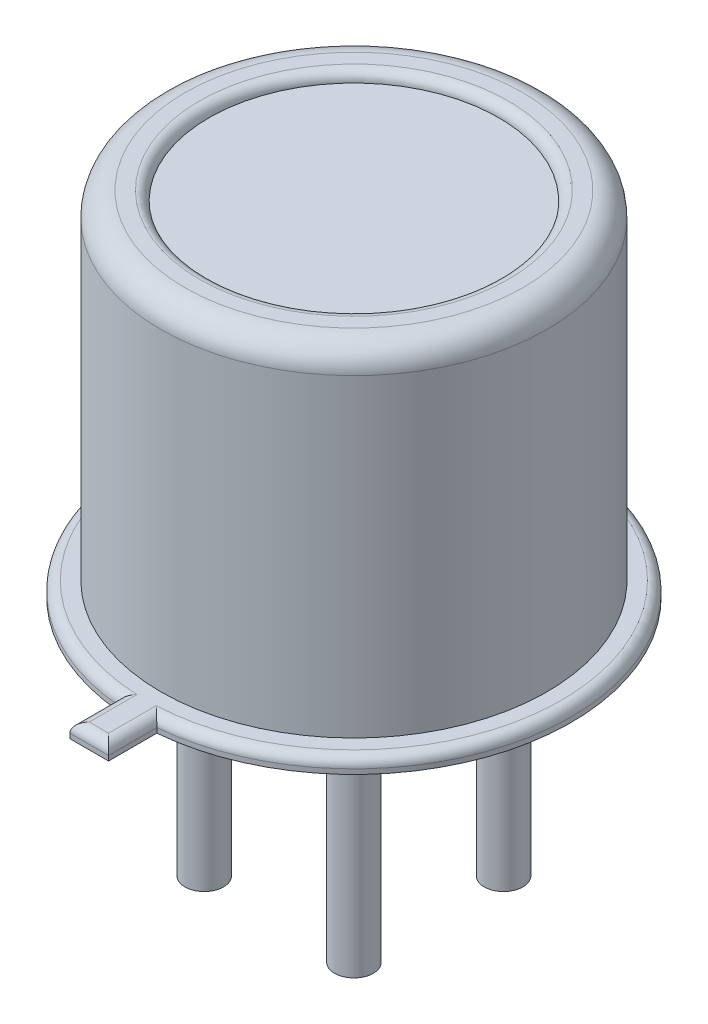
ISO-10303-21;
HEADER;
FILE_DESCRIPTION(('STEP AP214'),'2;1');
FILE_NAME('part.step','',(''),(''),'','','');
FILE_SCHEMA(('AUTOMOTIVE_DESIGN { 1 0 10303 214 1 1 1 1 }'));
ENDSEC;
DATA;
#1=APPLICATION_CONTEXT('core data for automotive mechanical design processes');
#2=APPLICATION_PROTOCOL_DEFINITION('international standard','automotive_design',2000,#1);
#3=PRODUCT_CONTEXT('',#1,'mechanical');
#4=PRODUCT('Part','Part','',(#3));
#5=PRODUCT_RELATED_PRODUCT_CATEGORY('part','',(#4));
#6=PRODUCT_DEFINITION_FORMATION('','',#4);
#7=PRODUCT_DEFINITION_CONTEXT('part definition',#1,'design');
#8=PRODUCT_DEFINITION('design','',#6,#7);
#9=PRODUCT_DEFINITION_SHAPE('','',#8);
#10=(LENGTH_UNIT() NAMED_UNIT(*) SI_UNIT(.MILLI.,.METRE.));
#11=(NAMED_UNIT(*) PLANE_ANGLE_UNIT() SI_UNIT($,.RADIAN.));
#12=(NAMED_UNIT(*) SI_UNIT($,.STERADIAN.) SOLID_ANGLE_UNIT());
#13=UNCERTAINTY_MEASURE_WITH_UNIT(LENGTH_MEASURE(1.E-05),#10,'distance_accuracy_value','');
#14=(GEOMETRIC_REPRESENTATION_CONTEXT(3) GLOBAL_UNCERTAINTY_ASSIGNED_CONTEXT((#13)) GLOBAL_UNIT_ASSIGNED_CONTEXT((#10,
#11,#12)) REPRESENTATION_CONTEXT('',''));
#15=CARTESIAN_POINT('',(0.,0.,0.));
#16=DIRECTION('',(0.,0.,1.));
#17=DIRECTION('',(1.,0.,0.));
#18=AXIS2_PLACEMENT_3D('',#15,#16,#17);
#19=CARTESIAN_POINT('',(0.,7.,0.));
#20=DIRECTION('',(0.,-1.,0.));
#21=DIRECTION('',(0.,0.,-1.));
#22=AXIS2_PLACEMENT_3D('',#19,#20,#21);
#23=CYLINDRICAL_SURFACE('',#22,4.);
#24=CARTESIAN_POINT('',(0.,6.5,0.));
#25=DIRECTION('',(0.,1.,0.));
#26=DIRECTION('',(0.,0.,1.));
#27=AXIS2_PLACEMENT_3D('',#24,#25,#26);
#28=CIRCLE('',#27,4.);
#29=CARTESIAN_POINT('',(0.,6.5,4.));
#30=VERTEX_POINT('',#29);
#31=EDGE_CURVE('E127',#30,#30,#28,.F.);
#32=ORIENTED_EDGE('',*,*,#31,.T.);
#33=EDGE_LOOP('',(#32));
#34=FACE_BOUND('',#33,.T.);
#35=CARTESIAN_POINT('',(0.,0.,0.));
#36=DIRECTION('',(0.,1.,0.));
#37=DIRECTION('',(0.,0.,1.));
#38=AXIS2_PLACEMENT_3D('',#35,#36,#37);
#39=CIRCLE('',#38,4.);
#40=CARTESIAN_POINT('',(0.,0.,4.));
#41=VERTEX_POINT('',#40);
#42=EDGE_CURVE('E104',#41,#41,#39,.T.);
#43=ORIENTED_EDGE('',*,*,#42,.T.);
#44=EDGE_LOOP('',(#43));
#45=FACE_BOUND('',#44,.T.);
#46=ADVANCED_FACE('F34',(#34,#45),#23,.T.);
#47=CARTESIAN_POINT('',(0.,7.,0.));
#48=DIRECTION('',(0.,1.,0.));
#49=DIRECTION('',(0.,0.,1.));
#50=AXIS2_PLACEMENT_3D('',#47,#48,#49);
#51=PLANE('',#50);
#52=CARTESIAN_POINT('',(0.,7.,0.));
#53=DIRECTION('',(0.,1.,0.));
#54=DIRECTION('',(0.,0.,1.));
#55=AXIS2_PLACEMENT_3D('',#52,#53,#54);
#56=CIRCLE('',#55,3.2);
#57=CARTESIAN_POINT('',(0.,7.,3.2));
#58=VERTEX_POINT('',#57);
#59=EDGE_CURVE('E130',#58,#58,#56,.F.);
#60=ORIENTED_EDGE('',*,*,#59,.T.);
#61=EDGE_LOOP('',(#60));
#62=FACE_BOUND('',#61,.T.);
#63=CARTESIAN_POINT('',(0.,7.,0.));
#64=DIRECTION('',(0.,1.,0.));
#65=DIRECTION('',(0.,0.,1.));
#66=AXIS2_PLACEMENT_3D('',#63,#64,#65);
#67=CIRCLE('',#66,3.5);
#68=CARTESIAN_POINT('',(0.,7.,3.5));
#69=VERTEX_POINT('',#68);
#70=EDGE_CURVE('E124',#69,#69,#67,.T.);
#71=ORIENTED_EDGE('',*,*,#70,.T.);
#72=EDGE_LOOP('',(#71));
#73=FACE_BOUND('',#72,.T.);
#74=ADVANCED_FACE('F175',(#62,#73),#51,.T.);
#75=CARTESIAN_POINT('',(0.,-0.3,5.48236258668128));
#76=DIRECTION('',(0.,0.,-1.));
#77=DIRECTION('',(-1.,0.,0.));
#78=AXIS2_PLACEMENT_3D('',#75,#76,#77);
#79=PLANE('',#78);
#80=DIRECTION('',(0.,1.,0.));
#81=VECTOR('',#80,1.);
#82=CARTESIAN_POINT('',(0.4,-0.3,5.48236258668128));
#83=LINE('',#82,#81);
#84=CARTESIAN_POINT('',(0.4,-0.3,5.48236258668128));
#85=VERTEX_POINT('',#84);
#86=CARTESIAN_POINT('',(0.4,-0.2,5.48236258668128));
#87=VERTEX_POINT('',#86);
#88=EDGE_CURVE('E116',#85,#87,#83,.T.);
#89=ORIENTED_EDGE('',*,*,#88,.T.);
#90=DIRECTION('',(-1.,0.,0.));
#91=VECTOR('',#90,1.);
#92=CARTESIAN_POINT('',(0.,-0.2,5.48236258668128));
#93=LINE('',#92,#91);
#94=CARTESIAN_POINT('',(-0.4,-0.2,5.48236258668128));
#95=VERTEX_POINT('',#94);
#96=EDGE_CURVE('E52',#87,#95,#93,.T.);
#97=ORIENTED_EDGE('',*,*,#96,.T.);
#98=DIRECTION('',(0.,1.,0.));
#99=VECTOR('',#98,1.);
#100=CARTESIAN_POINT('',(-0.4,-0.3,5.48236258668128));
#101=LINE('',#100,#99);
#102=CARTESIAN_POINT('',(-0.4,-0.3,5.48236258668128));
#103=VERTEX_POINT('',#102);
#104=EDGE_CURVE('E100',#103,#95,#101,.T.);
#105=ORIENTED_EDGE('',*,*,#104,.F.);
#106=DIRECTION('',(-1.,0.,0.));
#107=VECTOR('',#106,1.);
#108=CARTESIAN_POINT('',(0.,-0.3,5.48236258668128));
#109=LINE('',#108,#107);
#110=EDGE_CURVE('E90',#85,#103,#109,.T.);
#111=ORIENTED_EDGE('',*,*,#110,.F.);
#112=EDGE_LOOP('',(#89,#97,#105,#111));
#113=FACE_BOUND('',#112,.T.);
#114=ADVANCED_FACE('F101',(#113),#79,.F.);
#115=CARTESIAN_POINT('',(-0.4,-0.3,5.48236258668128));
#116=DIRECTION('',(1.,0.,0.));
#117=DIRECTION('',(0.,0.,-1.));
#118=AXIS2_PLACEMENT_3D('',#115,#116,#117);
#119=PLANE('',#118);
#120=ORIENTED_EDGE('',*,*,#104,.T.);
#121=DIRECTION('',(0.,0.,-1.));
#122=VECTOR('',#121,1.);
#123=CARTESIAN_POINT('',(-0.4,-0.2,5.48236258668128));
#124=LINE('',#123,#122);
#125=CARTESIAN_POINT('',(-0.4,-0.2,4.48236258668128));
#126=VERTEX_POINT('',#125);
#127=EDGE_CURVE('E147',#95,#126,#124,.T.);
#128=ORIENTED_EDGE('',*,*,#127,.T.);
#129=DIRECTION('',(0.,1.,0.));
#130=VECTOR('',#129,1.);
#131=CARTESIAN_POINT('',(-0.4,-0.3,4.48236258668128));
#132=LINE('',#131,#130);
#133=CARTESIAN_POINT('',(-0.4,-0.3,4.48236258668128));
#134=VERTEX_POINT('',#133);
#135=EDGE_CURVE('E105',#134,#126,#132,.T.);
#136=ORIENTED_EDGE('',*,*,#135,.F.);
#137=DIRECTION('',(0.,0.,-1.));
#138=VECTOR('',#137,1.);
#139=CARTESIAN_POINT('',(-0.4,-0.3,5.48236258668128));
#140=LINE('',#139,#138);
#141=EDGE_CURVE('E93',#103,#134,#140,.T.);
#142=ORIENTED_EDGE('',*,*,#141,.F.);
#143=EDGE_LOOP('',(#120,#128,#136,#142));
#144=FACE_BOUND('',#143,.T.);
#145=ADVANCED_FACE('F107',(#144),#119,.F.);
#146=CARTESIAN_POINT('',(0.,-0.3,0.));
#147=DIRECTION('',(0.,1.,0.));
#148=DIRECTION('',(0.,0.,1.));
#149=AXIS2_PLACEMENT_3D('',#146,#147,#148);
#150=CYLINDRICAL_SURFACE('',#149,4.50017492532014);
#151=ORIENTED_EDGE('',*,*,#135,.T.);
#152=CARTESIAN_POINT('',(0.,-0.2,0.));
#153=DIRECTION('',(0.,-1.,0.));
#154=DIRECTION('',(0.,0.,-1.));
#155=AXIS2_PLACEMENT_3D('',#152,#153,#154);
#156=CIRCLE('',#155,4.50017492532014);
#157=CARTESIAN_POINT('',(0.399999999999999,-0.2,4.48236258668128));
#158=VERTEX_POINT('',#157);
#159=EDGE_CURVE('E133',#126,#158,#156,.T.);
#160=ORIENTED_EDGE('',*,*,#159,.T.);
#161=DIRECTION('',(0.,1.,0.));
#162=VECTOR('',#161,1.);
#163=CARTESIAN_POINT('',(0.399999999999999,-0.3,4.48236258668128));
#164=LINE('',#163,#162);
#165=CARTESIAN_POINT('',(0.399999999999999,-0.3,4.48236258668128));
#166=VERTEX_POINT('',#165);
#167=EDGE_CURVE('E118',#166,#158,#164,.T.);
#168=ORIENTED_EDGE('',*,*,#167,.F.);
#169=CARTESIAN_POINT('',(0.,-0.3,0.));
#170=DIRECTION('',(0.,-1.,0.));
#171=DIRECTION('',(0.,0.,-1.));
#172=AXIS2_PLACEMENT_3D('',#169,#170,#171);
#173=CIRCLE('',#172,4.50017492532014);
#174=EDGE_CURVE('E110',#134,#166,#173,.T.);
#175=ORIENTED_EDGE('',*,*,#174,.F.);
#176=EDGE_LOOP('',(#151,#160,#168,#175));
#177=FACE_BOUND('',#176,.T.);
#178=ADVANCED_FACE('F241',(#177),#150,.T.);
#179=CARTESIAN_POINT('',(0.4,-0.3,5.48236258668128));
#180=DIRECTION('',(-1.,0.,0.));
#181=DIRECTION('',(0.,0.,1.));
#182=AXIS2_PLACEMENT_3D('',#179,#180,#181);
#183=PLANE('',#182);
#184=ORIENTED_EDGE('',*,*,#167,.T.);
#185=DIRECTION('',(0.,0.,1.));
#186=VECTOR('',#185,1.);
#187=CARTESIAN_POINT('',(0.4,-0.2,5.48236258668128));
#188=LINE('',#187,#186);
#189=EDGE_CURVE('E137',#158,#87,#188,.T.);
#190=ORIENTED_EDGE('',*,*,#189,.T.);
#191=ORIENTED_EDGE('',*,*,#88,.F.);
#192=DIRECTION('',(0.,0.,1.));
#193=VECTOR('',#192,1.);
#194=CARTESIAN_POINT('',(0.4,-0.3,5.48236258668128));
#195=LINE('',#194,#193);
#196=EDGE_CURVE('E96',#166,#85,#195,.T.);
#197=ORIENTED_EDGE('',*,*,#196,.F.);
#198=EDGE_LOOP('',(#184,#190,#191,#197));
#199=FACE_BOUND('',#198,.T.);
#200=ADVANCED_FACE('F232',(#199),#183,.F.);
#201=CARTESIAN_POINT('',(0.,-0.3,0.));
#202=DIRECTION('',(0.,-1.,0.));
#203=DIRECTION('',(0.,0.,-1.));
#204=AXIS2_PLACEMENT_3D('',#201,#202,#203);
#205=PLANE('',#204);
#206=CARTESIAN_POINT('',(-1.54999999999997,-0.3,-1.55));
#207=DIRECTION('',(0.,-1.,0.));
#208=DIRECTION('',(0.,0.,-1.));
#209=AXIS2_PLACEMENT_3D('',#206,#207,#208);
#210=CIRCLE('',#209,0.4);
#211=CARTESIAN_POINT('',(-1.54999999999997,-0.3,-1.95));
#212=VERTEX_POINT('',#211);
#213=EDGE_CURVE('E202',#212,#212,#210,.T.);
#214=ORIENTED_EDGE('',*,*,#213,.F.);
#215=EDGE_LOOP('',(#214));
#216=FACE_BOUND('',#215,.T.);
#217=CARTESIAN_POINT('',(1.55000000000003,-0.3,-1.54999999999996));
#218=DIRECTION('',(0.,-1.,0.));
#219=DIRECTION('',(0.,0.,-1.));
#220=AXIS2_PLACEMENT_3D('',#217,#218,#219);
#221=CIRCLE('',#220,0.4);
#222=CARTESIAN_POINT('',(1.55000000000003,-0.3,-1.94999999999996));
#223=VERTEX_POINT('',#222);
#224=EDGE_CURVE('E210',#223,#223,#221,.T.);
#225=ORIENTED_EDGE('',*,*,#224,.F.);
#226=EDGE_LOOP('',(#225));
#227=FACE_BOUND('',#226,.T.);
#228=CARTESIAN_POINT('',(1.55,-0.3,1.55000000000004));
#229=DIRECTION('',(0.,-1.,0.));
#230=DIRECTION('',(0.,0.,-1.));
#231=AXIS2_PLACEMENT_3D('',#228,#229,#230);
#232=CIRCLE('',#231,0.4);
#233=CARTESIAN_POINT('',(1.55,-0.3,1.15000000000004));
#234=VERTEX_POINT('',#233);
#235=EDGE_CURVE('E215',#234,#234,#232,.T.);
#236=ORIENTED_EDGE('',*,*,#235,.F.);
#237=EDGE_LOOP('',(#236));
#238=FACE_BOUND('',#237,.T.);
#239=CARTESIAN_POINT('',(-1.55,-0.3,1.55));
#240=DIRECTION('',(0.,-1.,0.));
#241=DIRECTION('',(0.,0.,-1.));
#242=AXIS2_PLACEMENT_3D('',#239,#240,#241);
#243=CIRCLE('',#242,0.4);
#244=CARTESIAN_POINT('',(-1.55,-0.3,1.15));
#245=VERTEX_POINT('',#244);
#246=EDGE_CURVE('E221',#245,#245,#243,.T.);
#247=ORIENTED_EDGE('',*,*,#246,.F.);
#248=EDGE_LOOP('',(#247));
#249=FACE_BOUND('',#248,.T.);
#250=ORIENTED_EDGE('',*,*,#110,.T.);
#251=ORIENTED_EDGE('',*,*,#141,.T.);
#252=ORIENTED_EDGE('',*,*,#174,.T.);
#253=ORIENTED_EDGE('',*,*,#196,.T.);
#254=EDGE_LOOP('',(#250,#251,#252,#253));
#255=FACE_BOUND('',#254,.T.);
#256=ADVANCED_FACE('F91',(#216,#227,#238,#249,#255),#205,.T.);
#257=CARTESIAN_POINT('',(0.,0.,0.));
#258=DIRECTION('',(0.,-1.,0.));
#259=DIRECTION('',(0.,0.,-1.));
#260=AXIS2_PLACEMENT_3D('',#257,#258,#259);
#261=PLANE('',#260);
#262=ORIENTED_EDGE('',*,*,#42,.F.);
#263=EDGE_LOOP('',(#262));
#264=FACE_BOUND('',#263,.T.);
#265=DIRECTION('',(0.,0.,1.));
#266=VECTOR('',#265,1.);
#267=CARTESIAN_POINT('',(0.2,0.,0.));
#268=LINE('',#267,#266);
#269=CARTESIAN_POINT('',(0.2,0.,5.28236258668128));
#270=VERTEX_POINT('',#269);
#271=CARTESIAN_POINT('',(0.2,0.,4.2955214338136));
#272=VERTEX_POINT('',#271);
#273=EDGE_CURVE('E144',#270,#272,#268,.F.);
#274=ORIENTED_EDGE('',*,*,#273,.T.);
#275=CARTESIAN_POINT('',(0.,0.,0.));
#276=DIRECTION('',(0.,-1.,0.));
#277=DIRECTION('',(0.,0.,-1.));
#278=AXIS2_PLACEMENT_3D('',#275,#276,#277);
#279=CIRCLE('',#278,4.30017492532014);
#280=CARTESIAN_POINT('',(-0.2,0.,4.2955214338136));
#281=VERTEX_POINT('',#280);
#282=EDGE_CURVE('E59',#272,#281,#279,.F.);
#283=ORIENTED_EDGE('',*,*,#282,.T.);
#284=DIRECTION('',(0.,0.,-1.));
#285=VECTOR('',#284,1.);
#286=CARTESIAN_POINT('',(-0.2,0.,0.));
#287=LINE('',#286,#285);
#288=CARTESIAN_POINT('',(-0.2,0.,5.28236258668128));
#289=VERTEX_POINT('',#288);
#290=EDGE_CURVE('E140',#281,#289,#287,.F.);
#291=ORIENTED_EDGE('',*,*,#290,.T.);
#292=DIRECTION('',(-1.,0.,0.));
#293=VECTOR('',#292,1.);
#294=CARTESIAN_POINT('',(0.,0.,5.28236258668128));
#295=LINE('',#294,#293);
#296=EDGE_CURVE('E142',#289,#270,#295,.F.);
#297=ORIENTED_EDGE('',*,*,#296,.T.);
#298=EDGE_LOOP('',(#274,#283,#291,#297));
#299=FACE_BOUND('',#298,.T.);
#300=ADVANCED_FACE('F231',(#264,#299),#261,.F.);
#301=CARTESIAN_POINT('',(-1.55,-5.3,1.55));
#302=DIRECTION('',(0.,1.,0.));
#303=DIRECTION('',(0.,0.,1.));
#304=AXIS2_PLACEMENT_3D('',#301,#302,#303);
#305=CYLINDRICAL_SURFACE('',#304,0.4);
#306=CARTESIAN_POINT('',(-1.55,-5.3,1.55));
#307=DIRECTION('',(0.,-1.,0.));
#308=DIRECTION('',(0.,0.,-1.));
#309=AXIS2_PLACEMENT_3D('',#306,#307,#308);
#310=CIRCLE('',#309,0.4);
#311=CARTESIAN_POINT('',(-1.55,-5.3,1.15));
#312=VERTEX_POINT('',#311);
#313=EDGE_CURVE('E98',#312,#312,#310,.T.);
#314=ORIENTED_EDGE('',*,*,#313,.F.);
#315=EDGE_LOOP('',(#314));
#316=FACE_BOUND('',#315,.T.);
#317=ORIENTED_EDGE('',*,*,#246,.T.);
#318=EDGE_LOOP('',(#317));
#319=FACE_BOUND('',#318,.T.);
#320=ADVANCED_FACE('F228',(#316,#319),#305,.T.);
#321=CARTESIAN_POINT('',(-1.55,-5.3,1.55));
#322=DIRECTION('',(0.,-1.,0.));
#323=DIRECTION('',(0.,0.,-1.));
#324=AXIS2_PLACEMENT_3D('',#321,#322,#323);
#325=PLANE('',#324);
#326=ORIENTED_EDGE('',*,*,#313,.T.);
#327=EDGE_LOOP('',(#326));
#328=FACE_BOUND('',#327,.T.);
#329=ADVANCED_FACE('F373',(#328),#325,.T.);
#330=CARTESIAN_POINT('',(1.55,-5.3,1.55000000000004));
#331=DIRECTION('',(0.,1.,0.));
#332=DIRECTION('',(0.,0.,1.));
#333=AXIS2_PLACEMENT_3D('',#330,#331,#332);
#334=CYLINDRICAL_SURFACE('',#333,0.4);
#335=CARTESIAN_POINT('',(1.55,-5.3,1.55000000000004));
#336=DIRECTION('',(0.,-1.,0.));
#337=DIRECTION('',(0.,0.,-1.));
#338=AXIS2_PLACEMENT_3D('',#335,#336,#337);
#339=CIRCLE('',#338,0.4);
#340=CARTESIAN_POINT('',(1.55,-5.3,1.15000000000004));
#341=VERTEX_POINT('',#340);
#342=EDGE_CURVE('E218',#341,#341,#339,.T.);
#343=ORIENTED_EDGE('',*,*,#342,.F.);
#344=EDGE_LOOP('',(#343));
#345=FACE_BOUND('',#344,.T.);
#346=ORIENTED_EDGE('',*,*,#235,.T.);
#347=EDGE_LOOP('',(#346));
#348=FACE_BOUND('',#347,.T.);
#349=ADVANCED_FACE('F364',(#345,#348),#334,.T.);
#350=CARTESIAN_POINT('',(1.55,-5.3,1.55000000000004));
#351=DIRECTION('',(0.,-1.,0.));
#352=DIRECTION('',(0.,0.,-1.));
#353=AXIS2_PLACEMENT_3D('',#350,#351,#352);
#354=PLANE('',#353);
#355=ORIENTED_EDGE('',*,*,#342,.T.);
#356=EDGE_LOOP('',(#355));
#357=FACE_BOUND('',#356,.T.);
#358=ADVANCED_FACE('F355',(#357),#354,.T.);
#359=CARTESIAN_POINT('',(1.55000000000003,-5.3,-1.54999999999996));
#360=DIRECTION('',(0.,1.,0.));
#361=DIRECTION('',(0.,0.,1.));
#362=AXIS2_PLACEMENT_3D('',#359,#360,#361);
#363=CYLINDRICAL_SURFACE('',#362,0.4);
#364=CARTESIAN_POINT('',(1.55000000000003,-5.3,-1.54999999999996));
#365=DIRECTION('',(0.,-1.,0.));
#366=DIRECTION('',(0.,0.,-1.));
#367=AXIS2_PLACEMENT_3D('',#364,#365,#366);
#368=CIRCLE('',#367,0.4);
#369=CARTESIAN_POINT('',(1.55000000000003,-5.3,-1.94999999999996));
#370=VERTEX_POINT('',#369);
#371=EDGE_CURVE('E212',#370,#370,#368,.T.);
#372=ORIENTED_EDGE('',*,*,#371,.F.);
#373=EDGE_LOOP('',(#372));
#374=FACE_BOUND('',#373,.T.);
#375=ORIENTED_EDGE('',*,*,#224,.T.);
#376=EDGE_LOOP('',(#375));
#377=FACE_BOUND('',#376,.T.);
#378=ADVANCED_FACE('F346',(#374,#377),#363,.T.);
#379=CARTESIAN_POINT('',(1.55000000000003,-5.3,-1.54999999999996));
#380=DIRECTION('',(0.,-1.,0.));
#381=DIRECTION('',(0.,0.,-1.));
#382=AXIS2_PLACEMENT_3D('',#379,#380,#381);
#383=PLANE('',#382);
#384=ORIENTED_EDGE('',*,*,#371,.T.);
#385=EDGE_LOOP('',(#384));
#386=FACE_BOUND('',#385,.T.);
#387=ADVANCED_FACE('F337',(#386),#383,.T.);
#388=CARTESIAN_POINT('',(-1.54999999999997,-5.3,-1.55));
#389=DIRECTION('',(0.,1.,0.));
#390=DIRECTION('',(0.,0.,1.));
#391=AXIS2_PLACEMENT_3D('',#388,#389,#390);
#392=CYLINDRICAL_SURFACE('',#391,0.4);
#393=CARTESIAN_POINT('',(-1.54999999999997,-5.3,-1.55));
#394=DIRECTION('',(0.,-1.,0.));
#395=DIRECTION('',(0.,0.,-1.));
#396=AXIS2_PLACEMENT_3D('',#393,#394,#395);
#397=CIRCLE('',#396,0.4);
#398=CARTESIAN_POINT('',(-1.54999999999997,-5.3,-1.95));
#399=VERTEX_POINT('',#398);
#400=EDGE_CURVE('E205',#399,#399,#397,.T.);
#401=ORIENTED_EDGE('',*,*,#400,.F.);
#402=EDGE_LOOP('',(#401));
#403=FACE_BOUND('',#402,.T.);
#404=ORIENTED_EDGE('',*,*,#213,.T.);
#405=EDGE_LOOP('',(#404));
#406=FACE_BOUND('',#405,.T.);
#407=ADVANCED_FACE('F328',(#403,#406),#392,.T.);
#408=CARTESIAN_POINT('',(-1.54999999999997,-5.3,-1.55));
#409=DIRECTION('',(0.,-1.,0.));
#410=DIRECTION('',(0.,0.,-1.));
#411=AXIS2_PLACEMENT_3D('',#408,#409,#410);
#412=PLANE('',#411);
#413=ORIENTED_EDGE('',*,*,#400,.T.);
#414=EDGE_LOOP('',(#413));
#415=FACE_BOUND('',#414,.T.);
#416=ADVANCED_FACE('F320',(#415),#412,.T.);
#417=CARTESIAN_POINT('',(0.,6.8,0.));
#418=DIRECTION('',(0.,1.,0.));
#419=DIRECTION('',(0.,0.,1.));
#420=AXIS2_PLACEMENT_3D('',#417,#418,#419);
#421=PLANE('',#420);
#422=CARTESIAN_POINT('',(0.,6.8,0.));
#423=DIRECTION('',(0.,1.,0.));
#424=DIRECTION('',(0.,0.,1.));
#425=AXIS2_PLACEMENT_3D('',#422,#423,#424);
#426=CIRCLE('',#425,3.);
#427=CARTESIAN_POINT('',(0.,6.8,3.));
#428=VERTEX_POINT('',#427);
#429=EDGE_CURVE('E200',#428,#428,#426,.T.);
#430=ORIENTED_EDGE('',*,*,#429,.T.);
#431=EDGE_LOOP('',(#430));
#432=FACE_BOUND('',#431,.T.);
#433=ADVANCED_FACE('F189',(#432),#421,.T.);
#434=CARTESIAN_POINT('',(0.,6.5,0.));
#435=DIRECTION('',(0.,1.,0.));
#436=DIRECTION('',(0.,0.,1.));
#437=AXIS2_PLACEMENT_3D('',#434,#435,#436);
#438=TOROIDAL_SURFACE('',#437,3.5,0.5);
#439=ORIENTED_EDGE('',*,*,#31,.F.);
#440=EDGE_LOOP('',(#439));
#441=FACE_BOUND('',#440,.T.);
#442=ORIENTED_EDGE('',*,*,#70,.F.);
#443=EDGE_LOOP('',(#442));
#444=FACE_BOUND('',#443,.T.);
#445=ADVANCED_FACE('F186',(#441,#444),#438,.T.);
#446=CARTESIAN_POINT('',(0.,6.8,0.));
#447=DIRECTION('',(0.,1.,0.));
#448=DIRECTION('',(0.,0.,1.));
#449=AXIS2_PLACEMENT_3D('',#446,#447,#448);
#450=TOROIDAL_SURFACE('',#449,3.2,0.2);
#451=ORIENTED_EDGE('',*,*,#59,.F.);
#452=EDGE_LOOP('',(#451));
#453=FACE_BOUND('',#452,.T.);
#454=ORIENTED_EDGE('',*,*,#429,.F.);
#455=EDGE_LOOP('',(#454));
#456=FACE_BOUND('',#455,.T.);
#457=ADVANCED_FACE('F188',(#453,#456),#450,.T.);
#458=CARTESIAN_POINT('',(0.,-0.2,0.));
#459=DIRECTION('',(0.,-1.,0.));
#460=DIRECTION('',(0.,0.,-1.));
#461=AXIS2_PLACEMENT_3D('',#458,#459,#460);
#462=TOROIDAL_SURFACE('',#461,4.30017492532014,0.2);
#463=ORIENTED_EDGE('',*,*,#159,.F.);
#464=CARTESIAN_POINT('',(-0.4,-0.2,4.48236258668207));
#465=CARTESIAN_POINT('',(-0.400014910627277,-0.190812499971907,4.48237583564053));
#466=CARTESIAN_POINT('',(-0.39936797351238,-0.181644924212762,4.48178445874744));
#467=CARTESIAN_POINT('',(-0.396878209390373,-0.163683390588694,4.47950630782734));
#468=CARTESIAN_POINT('',(-0.39504464849118,-0.154887095674682,4.47782802118943));
#469=CARTESIAN_POINT('',(-0.390311324473926,-0.137871252387649,4.47349172204581));
#470=CARTESIAN_POINT('',(-0.387413978078291,-0.129650446624743,4.47083593021624));
#471=CARTESIAN_POINT('',(-0.380722540497351,-0.113903063671303,4.46469505826048));
#472=CARTESIAN_POINT('',(-0.376926690256253,-0.10637788906264,4.46120835130924));
#473=CARTESIAN_POINT('',(-0.367101030565933,-0.0895292708943037,4.4521700593007));
#474=CARTESIAN_POINT('',(-0.360760233396395,-0.0805429795534527,4.44632815250703));
#475=CARTESIAN_POINT('',(-0.347109928051371,-0.0640828535993781,4.43372272682186));
#476=CARTESIAN_POINT('',(-0.339798718929924,-0.0566117342945747,4.42695758908316));
#477=CARTESIAN_POINT('',(-0.321888056491582,-0.0408455017276202,4.41034230434586));
#478=CARTESIAN_POINT('',(-0.311017767200181,-0.0331389115361546,4.40022709681495));
#479=CARTESIAN_POINT('',(-0.28855931085317,-0.0202070960323417,4.37925018149326));
#480=CARTESIAN_POINT('',(-0.276970410719352,-0.0149844533627901,4.36838771011648));
#481=CARTESIAN_POINT('',(-0.254838730846102,-0.00735350720921699,4.34756211873088));
#482=CARTESIAN_POINT('',(-0.244337925939502,-0.00468212520400508,4.33764811519586));
#483=CARTESIAN_POINT('',(-0.223232706641176,-0.00106641907566761,4.31765218045795));
#484=CARTESIAN_POINT('',(-0.212628533248647,-0.000118748855276355,4.30757061302756));
#485=CARTESIAN_POINT('',(-0.201364770939132,-3.49504924730956E-06,4.29682399205551));
#486=CARTESIAN_POINT('',(-0.200682326343976,-3.75770442084105E-09,4.29617273108377));
#487=CARTESIAN_POINT('',(-0.2,0.,4.2955214338136));
#488=B_SPLINE_CURVE_WITH_KNOTS('',3,(#464,#465,#466,#467,#468,#469,#470,#471,#472,#473,#474,
#475,#476,#477,#478,#479,#480,#481,#482,#483,#484,#485,#486,#487),.UNSPECIFIED.,.F.,.F.,(4,2,2,
2,2,2,2,2,2,2,2,4),(0.,0.0274891974735969,0.054766285905045,0.0819817854813379,
0.109251013728932,0.146406602614677,0.18362820005779,0.233548946362306,0.283521484068074,
0.327479242910386,0.371351578795363,0.374181556992729),.UNSPECIFIED.);
#489=EDGE_CURVE('E11',#126,#281,#488,.T.);
#490=ORIENTED_EDGE('',*,*,#489,.T.);
#491=ORIENTED_EDGE('',*,*,#282,.F.);
#492=CARTESIAN_POINT('',(0.4,-0.2,4.48236258668128));
#493=CARTESIAN_POINT('',(0.400014910627275,-0.190812499971876,4.48237583564025));
#494=CARTESIAN_POINT('',(0.399367973512376,-0.181644924212718,4.48178445874736));
#495=CARTESIAN_POINT('',(0.396878209390366,-0.163683390588658,4.47950630782741));
#496=CARTESIAN_POINT('',(0.395044648491176,-0.154887095674667,4.47782802118945));
#497=CARTESIAN_POINT('',(0.390311324473927,-0.137871252387654,4.47349172204579));
#498=CARTESIAN_POINT('',(0.387413978078293,-0.129650446624749,4.47083593021623));
#499=CARTESIAN_POINT('',(0.380722540497354,-0.113903063671308,4.46469505826048));
#500=CARTESIAN_POINT('',(0.376926690256256,-0.106377889062643,4.46120835130925));
#501=CARTESIAN_POINT('',(0.367101030565933,-0.0895292708943037,4.4521700593007));
#502=CARTESIAN_POINT('',(0.360760233396394,-0.0805429795534509,4.44632815250703));
#503=CARTESIAN_POINT('',(0.34710992805137,-0.0640828535993769,4.43372272682186));
#504=CARTESIAN_POINT('',(0.339798718929924,-0.0566117342945752,4.42695758908316));
#505=CARTESIAN_POINT('',(0.321888056491586,-0.0408455017276228,4.41034230434586));
#506=CARTESIAN_POINT('',(0.311017767200186,-0.0331389115361579,4.40022709681495));
#507=CARTESIAN_POINT('',(0.288559310853176,-0.0202070960323444,4.37925018149326));
#508=CARTESIAN_POINT('',(0.276970410719356,-0.0149844533627919,4.36838771011649));
#509=CARTESIAN_POINT('',(0.254838730846105,-0.00735350720921771,4.34756211873088));
#510=CARTESIAN_POINT('',(0.244337925939505,-0.00468212520400545,4.33764811519586));
#511=CARTESIAN_POINT('',(0.223232706641175,-0.0010664190756677,4.31765218045795));
#512=CARTESIAN_POINT('',(0.212628533248644,-0.000118748855276511,4.30757061302757));
#513=CARTESIAN_POINT('',(0.201364770939131,-3.49504924732869E-06,4.29682399205551));
#514=CARTESIAN_POINT('',(0.200682326343976,-3.75770443084698E-09,4.29617273108377));
#515=CARTESIAN_POINT('',(0.2,0.,4.2955214338136));
#516=B_SPLINE_CURVE_WITH_KNOTS('',3,(#492,#493,#494,#495,#496,#497,#498,#499,#500,#501,#502,
#503,#504,#505,#506,#507,#508,#509,#510,#511,#512,#513,#514,#515),.UNSPECIFIED.,.F.,.F.,(4,2,2,
2,2,2,2,2,2,2,2,4),(0.,0.0274891974735957,0.0547662859049943,0.0819817854812786,
0.109251013728881,0.146406602614632,0.183628200057736,0.233548946362249,0.28352148406802,
0.327479242910333,0.371351578795313,0.37418155699268),.UNSPECIFIED.);
#517=EDGE_CURVE('E44',#272,#158,#516,.F.);
#518=ORIENTED_EDGE('',*,*,#517,.T.);
#519=EDGE_LOOP('',(#463,#490,#491,#518));
#520=FACE_BOUND('',#519,.T.);
#521=ADVANCED_FACE('F159',(#520),#462,.T.);
#522=CARTESIAN_POINT('',(-0.2,-0.2,5.48236258668128));
#523=DIRECTION('',(0.,0.,-1.));
#524=DIRECTION('',(-1.,0.,0.));
#525=AXIS2_PLACEMENT_3D('',#522,#523,#524);
#526=CYLINDRICAL_SURFACE('',#525,0.2);
#527=ORIENTED_EDGE('',*,*,#489,.F.);
#528=ORIENTED_EDGE('',*,*,#127,.F.);
#529=CARTESIAN_POINT('',(-0.2,-0.2,5.28236258668128));
#530=DIRECTION('',(-0.707106781186547,0.,-0.707106781186548));
#531=DIRECTION('',(0.707106781186548,0.,-0.707106781186547));
#532=AXIS2_PLACEMENT_3D('',#529,#530,#531);
#533=ELLIPSE('',#532,0.282842712474619,0.2);
#534=EDGE_CURVE('E39',#289,#95,#533,.F.);
#535=ORIENTED_EDGE('',*,*,#534,.F.);
#536=ORIENTED_EDGE('',*,*,#290,.F.);
#537=EDGE_LOOP('',(#527,#528,#535,#536));
#538=FACE_BOUND('',#537,.T.);
#539=ADVANCED_FACE('F36',(#538),#526,.T.);
#540=CARTESIAN_POINT('',(0.,-0.2,5.28236258668128));
#541=DIRECTION('',(-1.,0.,0.));
#542=DIRECTION('',(0.,0.,1.));
#543=AXIS2_PLACEMENT_3D('',#540,#541,#542);
#544=CYLINDRICAL_SURFACE('',#543,0.2);
#545=ORIENTED_EDGE('',*,*,#534,.T.);
#546=ORIENTED_EDGE('',*,*,#96,.F.);
#547=CARTESIAN_POINT('',(0.2,-0.2,5.28236258668128));
#548=DIRECTION('',(-0.707106781186548,0.,0.707106781186547));
#549=DIRECTION('',(-0.707106781186547,0.,-0.707106781186548));
#550=AXIS2_PLACEMENT_3D('',#547,#548,#549);
#551=ELLIPSE('',#550,0.282842712474619,0.2);
#552=EDGE_CURVE('E207',#270,#87,#551,.F.);
#553=ORIENTED_EDGE('',*,*,#552,.F.);
#554=ORIENTED_EDGE('',*,*,#296,.F.);
#555=EDGE_LOOP('',(#545,#546,#553,#554));
#556=FACE_BOUND('',#555,.T.);
#557=ADVANCED_FACE('F165',(#556),#544,.T.);
#558=CARTESIAN_POINT('',(0.2,-0.2,5.48236258668128));
#559=DIRECTION('',(0.,0.,1.));
#560=DIRECTION('',(1.,0.,0.));
#561=AXIS2_PLACEMENT_3D('',#558,#559,#560);
#562=CYLINDRICAL_SURFACE('',#561,0.2);
#563=ORIENTED_EDGE('',*,*,#517,.F.);
#564=ORIENTED_EDGE('',*,*,#273,.F.);
#565=ORIENTED_EDGE('',*,*,#552,.T.);
#566=ORIENTED_EDGE('',*,*,#189,.F.);
#567=EDGE_LOOP('',(#563,#564,#565,#566));
#568=FACE_BOUND('',#567,.T.);
#569=ADVANCED_FACE('F162',(#568),#562,.T.);
#570=CLOSED_SHELL('',(#46,#74,#114,#145,#178,#200,#256,#300,#320,#329,#349,#358,#378,#387,#407,
#416,#433,#445,#457,#521,#539,#557,#569));
#571=MANIFOLD_SOLID_BREP('B2',#570);
#572=ADVANCED_BREP_SHAPE_REPRESENTATION('',(#18,#571),#14);
#573=SHAPE_DEFINITION_REPRESENTATION(#9,#572);
ENDSEC;
END-ISO-10303-21;
